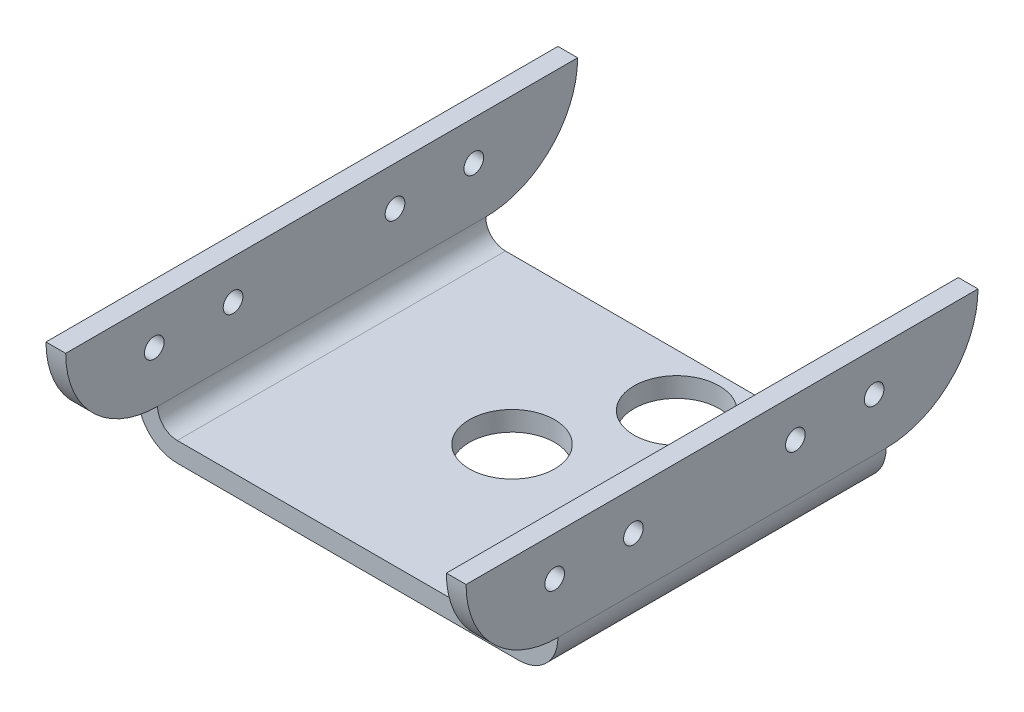
ISO-10303-21;
HEADER;
FILE_DESCRIPTION(('STEP AP214'),'2;1');
FILE_NAME('part.step','',(''),(''),'','','');
FILE_SCHEMA(('AUTOMOTIVE_DESIGN { 1 0 10303 214 1 1 1 1 }'));
ENDSEC;
DATA;
#1=APPLICATION_CONTEXT('core data for automotive mechanical design processes');
#2=APPLICATION_PROTOCOL_DEFINITION('international standard','automotive_design',2000,#1);
#3=PRODUCT_CONTEXT('',#1,'mechanical');
#4=PRODUCT('Part','Part','',(#3));
#5=PRODUCT_RELATED_PRODUCT_CATEGORY('part','',(#4));
#6=PRODUCT_DEFINITION_FORMATION('','',#4);
#7=PRODUCT_DEFINITION_CONTEXT('part definition',#1,'design');
#8=PRODUCT_DEFINITION('design','',#6,#7);
#9=PRODUCT_DEFINITION_SHAPE('','',#8);
#10=(LENGTH_UNIT() NAMED_UNIT(*) SI_UNIT(.MILLI.,.METRE.));
#11=(NAMED_UNIT(*) PLANE_ANGLE_UNIT() SI_UNIT($,.RADIAN.));
#12=(NAMED_UNIT(*) SI_UNIT($,.STERADIAN.) SOLID_ANGLE_UNIT());
#13=UNCERTAINTY_MEASURE_WITH_UNIT(LENGTH_MEASURE(1.E-05),#10,'distance_accuracy_value','');
#14=(GEOMETRIC_REPRESENTATION_CONTEXT(3) GLOBAL_UNCERTAINTY_ASSIGNED_CONTEXT((#13)) GLOBAL_UNIT_ASSIGNED_CONTEXT((#10,
#11,#12)) REPRESENTATION_CONTEXT('',''));
#15=CARTESIAN_POINT('',(0.,0.,0.));
#16=DIRECTION('',(0.,0.,1.));
#17=DIRECTION('',(1.,0.,0.));
#18=AXIS2_PLACEMENT_3D('',#15,#16,#17);
#19=CARTESIAN_POINT('',(98.0428571428571,0.,156.));
#20=DIRECTION('',(-1.,0.,0.));
#21=DIRECTION('',(0.,0.,1.));
#22=AXIS2_PLACEMENT_3D('',#19,#20,#21);
#23=PLANE('',#22);
#24=CARTESIAN_POINT('',(98.0428571428571,28.0000000000001,31.6473535322335));
#25=DIRECTION('',(-1.,0.,0.));
#26=DIRECTION('',(0.,0.,1.));
#27=AXIS2_PLACEMENT_3D('',#24,#25,#26);
#28=CIRCLE('',#27,2.99999999999999);
#29=CARTESIAN_POINT('',(98.0428571428571,28.0000000000001,34.6473535322335));
#30=VERTEX_POINT('',#29);
#31=EDGE_CURVE('E293',#30,#30,#28,.T.);
#32=ORIENTED_EDGE('',*,*,#31,.T.);
#33=EDGE_LOOP('',(#32));
#34=FACE_BOUND('',#33,.T.);
#35=CARTESIAN_POINT('',(98.0428571428571,28.0000000000001,55.6473535322335));
#36=DIRECTION('',(-1.,0.,0.));
#37=DIRECTION('',(0.,0.,1.));
#38=AXIS2_PLACEMENT_3D('',#35,#36,#37);
#39=CIRCLE('',#38,3.);
#40=CARTESIAN_POINT('',(98.0428571428571,28.0000000000001,58.6473535322335));
#41=VERTEX_POINT('',#40);
#42=EDGE_CURVE('E304',#41,#41,#39,.T.);
#43=ORIENTED_EDGE('',*,*,#42,.T.);
#44=EDGE_LOOP('',(#43));
#45=FACE_BOUND('',#44,.T.);
#46=CARTESIAN_POINT('',(98.0428571428571,28.,105.));
#47=DIRECTION('',(-1.,0.,0.));
#48=DIRECTION('',(0.,0.,1.));
#49=AXIS2_PLACEMENT_3D('',#46,#47,#48);
#50=CIRCLE('',#49,2.99999999999999);
#51=CARTESIAN_POINT('',(98.0428571428571,28.,108.));
#52=VERTEX_POINT('',#51);
#53=EDGE_CURVE('E297',#52,#52,#50,.T.);
#54=ORIENTED_EDGE('',*,*,#53,.T.);
#55=EDGE_LOOP('',(#54));
#56=FACE_BOUND('',#55,.T.);
#57=CARTESIAN_POINT('',(98.0428571428571,28.,129.));
#58=DIRECTION('',(-1.,0.,0.));
#59=DIRECTION('',(0.,0.,1.));
#60=AXIS2_PLACEMENT_3D('',#57,#58,#59);
#61=CIRCLE('',#60,2.99999999999999);
#62=CARTESIAN_POINT('',(98.0428571428571,28.,132.));
#63=VERTEX_POINT('',#62);
#64=EDGE_CURVE('E298',#63,#63,#61,.T.);
#65=ORIENTED_EDGE('',*,*,#64,.T.);
#66=EDGE_LOOP('',(#65));
#67=FACE_BOUND('',#66,.T.);
#68=DIRECTION('',(0.,0.,-1.));
#69=VECTOR('',#68,1.);
#70=CARTESIAN_POINT('',(98.0428571428571,40.,156.));
#71=LINE('',#70,#69);
#72=CARTESIAN_POINT('',(98.0428571428571,40.,156.));
#73=VERTEX_POINT('',#72);
#74=CARTESIAN_POINT('',(98.0428571428571,40.,0.));
#75=VERTEX_POINT('',#74);
#76=EDGE_CURVE('E179',#73,#75,#71,.T.);
#77=ORIENTED_EDGE('',*,*,#76,.F.);
#78=CARTESIAN_POINT('',(98.0428571428571,40.,128.));
#79=DIRECTION('',(-1.,0.,0.));
#80=DIRECTION('',(0.,0.,-1.));
#81=AXIS2_PLACEMENT_3D('',#78,#79,#80);
#82=CIRCLE('',#81,28.);
#83=CARTESIAN_POINT('',(98.0428571428571,12.,128.));
#84=VERTEX_POINT('',#83);
#85=EDGE_CURVE('E58',#84,#73,#82,.T.);
#86=ORIENTED_EDGE('',*,*,#85,.F.);
#87=DIRECTION('',(0.,0.,-1.));
#88=VECTOR('',#87,1.);
#89=CARTESIAN_POINT('',(98.0428571428571,12.,156.));
#90=LINE('',#89,#88);
#91=CARTESIAN_POINT('',(98.0428571428571,12.,28.));
#92=VERTEX_POINT('',#91);
#93=EDGE_CURVE('E141',#84,#92,#90,.T.);
#94=ORIENTED_EDGE('',*,*,#93,.T.);
#95=CARTESIAN_POINT('',(98.0428571428571,40.,28.));
#96=DIRECTION('',(-1.,0.,0.));
#97=DIRECTION('',(0.,0.,1.));
#98=AXIS2_PLACEMENT_3D('',#95,#96,#97);
#99=CIRCLE('',#98,28.);
#100=EDGE_CURVE('E194',#75,#92,#99,.T.);
#101=ORIENTED_EDGE('',*,*,#100,.F.);
#102=EDGE_LOOP('',(#77,#86,#94,#101));
#103=FACE_BOUND('',#102,.T.);
#104=ADVANCED_FACE('F44',(#34,#45,#56,#67,#103),#23,.F.);
#105=CARTESIAN_POINT('',(92.0428571428571,40.,156.));
#106=DIRECTION('',(0.,1.,0.));
#107=DIRECTION('',(0.,0.,1.));
#108=AXIS2_PLACEMENT_3D('',#105,#106,#107);
#109=PLANE('',#108);
#110=DIRECTION('',(1.,0.,0.));
#111=VECTOR('',#110,1.);
#112=CARTESIAN_POINT('',(92.0428571428571,40.,0.));
#113=LINE('',#112,#111);
#114=CARTESIAN_POINT('',(92.0428571428571,40.,0.));
#115=VERTEX_POINT('',#114);
#116=EDGE_CURVE('E230',#115,#75,#113,.T.);
#117=ORIENTED_EDGE('',*,*,#116,.F.);
#118=DIRECTION('',(0.,0.,-1.));
#119=VECTOR('',#118,1.);
#120=CARTESIAN_POINT('',(92.0428571428571,40.,156.));
#121=LINE('',#120,#119);
#122=CARTESIAN_POINT('',(92.0428571428571,40.,156.));
#123=VERTEX_POINT('',#122);
#124=EDGE_CURVE('E176',#123,#115,#121,.T.);
#125=ORIENTED_EDGE('',*,*,#124,.F.);
#126=DIRECTION('',(1.,0.,0.));
#127=VECTOR('',#126,1.);
#128=CARTESIAN_POINT('',(92.0428571428571,40.,156.));
#129=LINE('',#128,#127);
#130=EDGE_CURVE('E142',#123,#73,#129,.T.);
#131=ORIENTED_EDGE('',*,*,#130,.T.);
#132=ORIENTED_EDGE('',*,*,#76,.T.);
#133=EDGE_LOOP('',(#117,#125,#131,#132));
#134=FACE_BOUND('',#133,.T.);
#135=ADVANCED_FACE('F350',(#134),#109,.T.);
#136=CARTESIAN_POINT('',(92.0428571428571,0.,156.));
#137=DIRECTION('',(-1.,0.,0.));
#138=DIRECTION('',(0.,0.,1.));
#139=AXIS2_PLACEMENT_3D('',#136,#137,#138);
#140=PLANE('',#139);
#141=CARTESIAN_POINT('',(92.0428571428571,28.0000000000001,31.6473535322335));
#142=DIRECTION('',(-1.,0.,0.));
#143=DIRECTION('',(0.,0.,1.));
#144=AXIS2_PLACEMENT_3D('',#141,#142,#143);
#145=CIRCLE('',#144,2.99999999999999);
#146=CARTESIAN_POINT('',(92.0428571428571,28.0000000000001,34.6473535322335));
#147=VERTEX_POINT('',#146);
#148=EDGE_CURVE('E267',#147,#147,#145,.T.);
#149=ORIENTED_EDGE('',*,*,#148,.F.);
#150=EDGE_LOOP('',(#149));
#151=FACE_BOUND('',#150,.T.);
#152=CARTESIAN_POINT('',(92.0428571428571,28.0000000000001,55.6473535322335));
#153=DIRECTION('',(-1.,0.,0.));
#154=DIRECTION('',(0.,0.,1.));
#155=AXIS2_PLACEMENT_3D('',#152,#153,#154);
#156=CIRCLE('',#155,3.);
#157=CARTESIAN_POINT('',(92.0428571428571,28.0000000000001,58.6473535322335));
#158=VERTEX_POINT('',#157);
#159=EDGE_CURVE('E275',#158,#158,#156,.T.);
#160=ORIENTED_EDGE('',*,*,#159,.F.);
#161=EDGE_LOOP('',(#160));
#162=FACE_BOUND('',#161,.T.);
#163=CARTESIAN_POINT('',(92.0428571428571,28.,105.));
#164=DIRECTION('',(-1.,0.,0.));
#165=DIRECTION('',(0.,0.,1.));
#166=AXIS2_PLACEMENT_3D('',#163,#164,#165);
#167=CIRCLE('',#166,2.99999999999999);
#168=CARTESIAN_POINT('',(92.0428571428571,28.,108.));
#169=VERTEX_POINT('',#168);
#170=EDGE_CURVE('E281',#169,#169,#167,.T.);
#171=ORIENTED_EDGE('',*,*,#170,.F.);
#172=EDGE_LOOP('',(#171));
#173=FACE_BOUND('',#172,.T.);
#174=CARTESIAN_POINT('',(92.0428571428571,28.,129.));
#175=DIRECTION('',(-1.,0.,0.));
#176=DIRECTION('',(0.,0.,1.));
#177=AXIS2_PLACEMENT_3D('',#174,#175,#176);
#178=CIRCLE('',#177,2.99999999999999);
#179=CARTESIAN_POINT('',(92.0428571428571,28.,132.));
#180=VERTEX_POINT('',#179);
#181=EDGE_CURVE('E287',#180,#180,#178,.T.);
#182=ORIENTED_EDGE('',*,*,#181,.F.);
#183=EDGE_LOOP('',(#182));
#184=FACE_BOUND('',#183,.T.);
#185=CARTESIAN_POINT('',(92.0428571428571,40.,128.));
#186=DIRECTION('',(-1.,0.,0.));
#187=DIRECTION('',(0.,0.,1.));
#188=AXIS2_PLACEMENT_3D('',#185,#186,#187);
#189=CIRCLE('',#188,28.);
#190=CARTESIAN_POINT('',(92.0428571428571,12.,128.));
#191=VERTEX_POINT('',#190);
#192=EDGE_CURVE('E213',#123,#191,#189,.F.);
#193=ORIENTED_EDGE('',*,*,#192,.F.);
#194=ORIENTED_EDGE('',*,*,#124,.T.);
#195=CARTESIAN_POINT('',(92.0428571428571,40.,28.));
#196=DIRECTION('',(-1.,0.,0.));
#197=DIRECTION('',(0.,0.,1.));
#198=AXIS2_PLACEMENT_3D('',#195,#196,#197);
#199=CIRCLE('',#198,28.);
#200=CARTESIAN_POINT('',(92.0428571428571,12.,28.));
#201=VERTEX_POINT('',#200);
#202=EDGE_CURVE('E242',#201,#115,#199,.F.);
#203=ORIENTED_EDGE('',*,*,#202,.F.);
#204=DIRECTION('',(0.,0.,-1.));
#205=VECTOR('',#204,1.);
#206=CARTESIAN_POINT('',(92.0428571428571,12.,156.));
#207=LINE('',#206,#205);
#208=EDGE_CURVE('E173',#191,#201,#207,.T.);
#209=ORIENTED_EDGE('',*,*,#208,.F.);
#210=EDGE_LOOP('',(#193,#194,#203,#209));
#211=FACE_BOUND('',#210,.T.);
#212=ADVANCED_FACE('F357',(#151,#162,#173,#184,#211),#140,.T.);
#213=CARTESIAN_POINT('',(86.0428571428571,12.,156.));
#214=DIRECTION('',(0.,0.,-1.));
#215=DIRECTION('',(-1.,0.,0.));
#216=AXIS2_PLACEMENT_3D('',#213,#214,#215);
#217=CYLINDRICAL_SURFACE('',#216,6.);
#218=CARTESIAN_POINT('',(86.0428571428571,12.,128.));
#219=DIRECTION('',(0.,0.,-1.));
#220=DIRECTION('',(-1.,0.,0.));
#221=AXIS2_PLACEMENT_3D('',#218,#219,#220);
#222=CIRCLE('',#221,6.);
#223=CARTESIAN_POINT('',(86.0428571428571,6.,128.));
#224=VERTEX_POINT('',#223);
#225=EDGE_CURVE('E228',#191,#224,#222,.T.);
#226=ORIENTED_EDGE('',*,*,#225,.F.);
#227=ORIENTED_EDGE('',*,*,#208,.T.);
#228=CARTESIAN_POINT('',(86.0428571428571,12.,28.));
#229=DIRECTION('',(0.,0.,1.));
#230=DIRECTION('',(1.,0.,0.));
#231=AXIS2_PLACEMENT_3D('',#228,#229,#230);
#232=CIRCLE('',#231,6.);
#233=CARTESIAN_POINT('',(86.0428571428571,6.,28.));
#234=VERTEX_POINT('',#233);
#235=EDGE_CURVE('E221',#234,#201,#232,.T.);
#236=ORIENTED_EDGE('',*,*,#235,.F.);
#237=DIRECTION('',(0.,0.,-1.));
#238=VECTOR('',#237,1.);
#239=CARTESIAN_POINT('',(86.0428571428571,6.,156.));
#240=LINE('',#239,#238);
#241=EDGE_CURVE('E170',#224,#234,#240,.T.);
#242=ORIENTED_EDGE('',*,*,#241,.F.);
#243=EDGE_LOOP('',(#226,#227,#236,#242));
#244=FACE_BOUND('',#243,.T.);
#245=ADVANCED_FACE('F392',(#244),#217,.F.);
#246=CARTESIAN_POINT('',(-29.9571428571429,6.,156.));
#247=DIRECTION('',(0.,1.,0.));
#248=DIRECTION('',(0.,0.,1.));
#249=AXIS2_PLACEMENT_3D('',#246,#247,#248);
#250=PLANE('',#249);
#251=CARTESIAN_POINT('',(34.0428571428571,6.,78.));
#252=DIRECTION('',(0.,1.,0.));
#253=DIRECTION('',(0.,0.,1.));
#254=AXIS2_PLACEMENT_3D('',#251,#252,#253);
#255=CIRCLE('',#254,13.);
#256=CARTESIAN_POINT('',(34.0428571428571,6.,91.));
#257=VERTEX_POINT('',#256);
#258=EDGE_CURVE('E254',#257,#257,#255,.T.);
#259=ORIENTED_EDGE('',*,*,#258,.F.);
#260=EDGE_LOOP('',(#259));
#261=FACE_BOUND('',#260,.T.);
#262=CARTESIAN_POINT('',(50.2126085257987,6.,44.));
#263=DIRECTION('',(0.,1.,0.));
#264=DIRECTION('',(0.,0.,1.));
#265=AXIS2_PLACEMENT_3D('',#262,#263,#264);
#266=CIRCLE('',#265,13.);
#267=CARTESIAN_POINT('',(50.2126085257987,6.,57.));
#268=VERTEX_POINT('',#267);
#269=EDGE_CURVE('E260',#268,#268,#266,.T.);
#270=ORIENTED_EDGE('',*,*,#269,.F.);
#271=EDGE_LOOP('',(#270));
#272=FACE_BOUND('',#271,.T.);
#273=DIRECTION('',(-1.,0.,0.));
#274=VECTOR('',#273,1.);
#275=CARTESIAN_POINT('',(-29.9571428571429,6.,128.));
#276=LINE('',#275,#274);
#277=CARTESIAN_POINT('',(-17.9571428571429,6.,128.));
#278=VERTEX_POINT('',#277);
#279=EDGE_CURVE('E226',#224,#278,#276,.T.);
#280=ORIENTED_EDGE('',*,*,#279,.F.);
#281=ORIENTED_EDGE('',*,*,#241,.T.);
#282=DIRECTION('',(1.,0.,0.));
#283=VECTOR('',#282,1.);
#284=CARTESIAN_POINT('',(-29.9571428571429,6.,28.));
#285=LINE('',#284,#283);
#286=CARTESIAN_POINT('',(-17.9571428571429,6.,28.));
#287=VERTEX_POINT('',#286);
#288=EDGE_CURVE('E215',#287,#234,#285,.T.);
#289=ORIENTED_EDGE('',*,*,#288,.F.);
#290=DIRECTION('',(0.,0.,-1.));
#291=VECTOR('',#290,1.);
#292=CARTESIAN_POINT('',(-17.9571428571429,6.,156.));
#293=LINE('',#292,#291);
#294=EDGE_CURVE('E167',#278,#287,#293,.T.);
#295=ORIENTED_EDGE('',*,*,#294,.F.);
#296=EDGE_LOOP('',(#280,#281,#289,#295));
#297=FACE_BOUND('',#296,.T.);
#298=ADVANCED_FACE('F438',(#261,#272,#297),#250,.T.);
#299=CARTESIAN_POINT('',(-17.9571428571429,12.,156.));
#300=DIRECTION('',(0.,0.,-1.));
#301=DIRECTION('',(-1.,0.,0.));
#302=AXIS2_PLACEMENT_3D('',#299,#300,#301);
#303=CYLINDRICAL_SURFACE('',#302,6.);
#304=CARTESIAN_POINT('',(-17.9571428571429,12.,128.));
#305=DIRECTION('',(0.,0.,-1.));
#306=DIRECTION('',(-1.,0.,0.));
#307=AXIS2_PLACEMENT_3D('',#304,#305,#306);
#308=CIRCLE('',#307,6.);
#309=CARTESIAN_POINT('',(-23.9571428571429,12.,128.));
#310=VERTEX_POINT('',#309);
#311=EDGE_CURVE('E224',#278,#310,#308,.T.);
#312=ORIENTED_EDGE('',*,*,#311,.F.);
#313=ORIENTED_EDGE('',*,*,#294,.T.);
#314=CARTESIAN_POINT('',(-17.9571428571429,12.,28.));
#315=DIRECTION('',(0.,0.,1.));
#316=DIRECTION('',(1.,0.,0.));
#317=AXIS2_PLACEMENT_3D('',#314,#315,#316);
#318=CIRCLE('',#317,6.);
#319=CARTESIAN_POINT('',(-23.9571428571429,12.,28.));
#320=VERTEX_POINT('',#319);
#321=EDGE_CURVE('E212',#320,#287,#318,.T.);
#322=ORIENTED_EDGE('',*,*,#321,.F.);
#323=DIRECTION('',(0.,0.,-1.));
#324=VECTOR('',#323,1.);
#325=CARTESIAN_POINT('',(-23.9571428571429,12.,156.));
#326=LINE('',#325,#324);
#327=EDGE_CURVE('E159',#310,#320,#326,.T.);
#328=ORIENTED_EDGE('',*,*,#327,.F.);
#329=EDGE_LOOP('',(#312,#313,#322,#328));
#330=FACE_BOUND('',#329,.T.);
#331=ADVANCED_FACE('F434',(#330),#303,.F.);
#332=CARTESIAN_POINT('',(-23.9571428571429,40.,156.));
#333=DIRECTION('',(1.,0.,0.));
#334=DIRECTION('',(0.,1.,0.));
#335=AXIS2_PLACEMENT_3D('',#332,#333,#334);
#336=PLANE('',#335);
#337=CARTESIAN_POINT('',(-23.9571428571429,28.0000000000001,31.6473535322335));
#338=DIRECTION('',(1.,0.,0.));
#339=DIRECTION('',(0.,1.,0.));
#340=AXIS2_PLACEMENT_3D('',#337,#338,#339);
#341=CIRCLE('',#340,2.99999999999999);
#342=CARTESIAN_POINT('',(-23.9571428571429,31.0000000000001,31.6473535322335));
#343=VERTEX_POINT('',#342);
#344=EDGE_CURVE('E272',#343,#343,#341,.T.);
#345=ORIENTED_EDGE('',*,*,#344,.F.);
#346=EDGE_LOOP('',(#345));
#347=FACE_BOUND('',#346,.T.);
#348=CARTESIAN_POINT('',(-23.9571428571429,28.0000000000001,55.6473535322335));
#349=DIRECTION('',(1.,0.,0.));
#350=DIRECTION('',(0.,1.,0.));
#351=AXIS2_PLACEMENT_3D('',#348,#349,#350);
#352=CIRCLE('',#351,3.);
#353=CARTESIAN_POINT('',(-23.9571428571429,31.0000000000001,55.6473535322335));
#354=VERTEX_POINT('',#353);
#355=EDGE_CURVE('E278',#354,#354,#352,.T.);
#356=ORIENTED_EDGE('',*,*,#355,.F.);
#357=EDGE_LOOP('',(#356));
#358=FACE_BOUND('',#357,.T.);
#359=CARTESIAN_POINT('',(-23.9571428571429,28.,105.));
#360=DIRECTION('',(1.,0.,0.));
#361=DIRECTION('',(0.,1.,0.));
#362=AXIS2_PLACEMENT_3D('',#359,#360,#361);
#363=CIRCLE('',#362,2.99999999999999);
#364=CARTESIAN_POINT('',(-23.9571428571429,31.,105.));
#365=VERTEX_POINT('',#364);
#366=EDGE_CURVE('E284',#365,#365,#363,.T.);
#367=ORIENTED_EDGE('',*,*,#366,.F.);
#368=EDGE_LOOP('',(#367));
#369=FACE_BOUND('',#368,.T.);
#370=CARTESIAN_POINT('',(-23.9571428571429,28.,129.));
#371=DIRECTION('',(1.,0.,0.));
#372=DIRECTION('',(0.,1.,0.));
#373=AXIS2_PLACEMENT_3D('',#370,#371,#372);
#374=CIRCLE('',#373,2.99999999999999);
#375=CARTESIAN_POINT('',(-23.9571428571429,31.,129.));
#376=VERTEX_POINT('',#375);
#377=EDGE_CURVE('E290',#376,#376,#374,.T.);
#378=ORIENTED_EDGE('',*,*,#377,.F.);
#379=EDGE_LOOP('',(#378));
#380=FACE_BOUND('',#379,.T.);
#381=CARTESIAN_POINT('',(-23.9571428571429,40.,128.));
#382=DIRECTION('',(1.,0.,0.));
#383=DIRECTION('',(0.,1.,0.));
#384=AXIS2_PLACEMENT_3D('',#381,#382,#383);
#385=CIRCLE('',#384,28.);
#386=CARTESIAN_POINT('',(-23.9571428571429,40.,156.));
#387=VERTEX_POINT('',#386);
#388=EDGE_CURVE('E136',#310,#387,#385,.F.);
#389=ORIENTED_EDGE('',*,*,#388,.F.);
#390=ORIENTED_EDGE('',*,*,#327,.T.);
#391=CARTESIAN_POINT('',(-23.9571428571429,40.,28.));
#392=DIRECTION('',(1.,0.,0.));
#393=DIRECTION('',(0.,1.,0.));
#394=AXIS2_PLACEMENT_3D('',#391,#392,#393);
#395=CIRCLE('',#394,28.);
#396=CARTESIAN_POINT('',(-23.9571428571429,40.,0.));
#397=VERTEX_POINT('',#396);
#398=EDGE_CURVE('E237',#397,#320,#395,.F.);
#399=ORIENTED_EDGE('',*,*,#398,.F.);
#400=DIRECTION('',(0.,0.,-1.));
#401=VECTOR('',#400,1.);
#402=CARTESIAN_POINT('',(-23.9571428571429,40.,156.));
#403=LINE('',#402,#401);
#404=EDGE_CURVE('E157',#387,#397,#403,.T.);
#405=ORIENTED_EDGE('',*,*,#404,.F.);
#406=EDGE_LOOP('',(#389,#390,#399,#405));
#407=FACE_BOUND('',#406,.T.);
#408=ADVANCED_FACE('F240',(#347,#358,#369,#380,#407),#336,.T.);
#409=CARTESIAN_POINT('',(-29.9571428571429,40.,156.));
#410=DIRECTION('',(0.,1.,0.));
#411=DIRECTION('',(0.,0.,1.));
#412=AXIS2_PLACEMENT_3D('',#409,#410,#411);
#413=PLANE('',#412);
#414=DIRECTION('',(1.,0.,0.));
#415=VECTOR('',#414,1.);
#416=CARTESIAN_POINT('',(-29.9571428571429,40.,0.));
#417=LINE('',#416,#415);
#418=CARTESIAN_POINT('',(-29.9571428571429,40.,0.));
#419=VERTEX_POINT('',#418);
#420=EDGE_CURVE('E156',#419,#397,#417,.T.);
#421=ORIENTED_EDGE('',*,*,#420,.F.);
#422=DIRECTION('',(0.,0.,-1.));
#423=VECTOR('',#422,1.);
#424=CARTESIAN_POINT('',(-29.9571428571429,40.,156.));
#425=LINE('',#424,#423);
#426=CARTESIAN_POINT('',(-29.9571428571429,40.,156.));
#427=VERTEX_POINT('',#426);
#428=EDGE_CURVE('E149',#427,#419,#425,.T.);
#429=ORIENTED_EDGE('',*,*,#428,.F.);
#430=DIRECTION('',(1.,0.,0.));
#431=VECTOR('',#430,1.);
#432=CARTESIAN_POINT('',(-29.9571428571429,40.,156.));
#433=LINE('',#432,#431);
#434=EDGE_CURVE('E129',#427,#387,#433,.T.);
#435=ORIENTED_EDGE('',*,*,#434,.T.);
#436=ORIENTED_EDGE('',*,*,#404,.T.);
#437=EDGE_LOOP('',(#421,#429,#435,#436));
#438=FACE_BOUND('',#437,.T.);
#439=ADVANCED_FACE('F155',(#438),#413,.T.);
#440=CARTESIAN_POINT('',(-29.9571428571429,40.,156.));
#441=DIRECTION('',(1.,0.,0.));
#442=DIRECTION('',(0.,1.,0.));
#443=AXIS2_PLACEMENT_3D('',#440,#441,#442);
#444=PLANE('',#443);
#445=CARTESIAN_POINT('',(-29.9571428571429,28.0000000000001,31.6473535322335));
#446=DIRECTION('',(-1.,0.,0.));
#447=DIRECTION('',(0.,0.,1.));
#448=AXIS2_PLACEMENT_3D('',#445,#446,#447);
#449=CIRCLE('',#448,2.99999999999999);
#450=CARTESIAN_POINT('',(-29.9571428571429,28.0000000000001,34.6473535322335));
#451=VERTEX_POINT('',#450);
#452=EDGE_CURVE('E310',#451,#451,#449,.T.);
#453=ORIENTED_EDGE('',*,*,#452,.F.);
#454=EDGE_LOOP('',(#453));
#455=FACE_BOUND('',#454,.T.);
#456=CARTESIAN_POINT('',(-29.9571428571429,28.0000000000001,55.6473535322335));
#457=DIRECTION('',(-1.,0.,0.));
#458=DIRECTION('',(0.,0.,1.));
#459=AXIS2_PLACEMENT_3D('',#456,#457,#458);
#460=CIRCLE('',#459,3.);
#461=CARTESIAN_POINT('',(-29.9571428571429,28.0000000000001,58.6473535322335));
#462=VERTEX_POINT('',#461);
#463=EDGE_CURVE('E307',#462,#462,#460,.T.);
#464=ORIENTED_EDGE('',*,*,#463,.F.);
#465=EDGE_LOOP('',(#464));
#466=FACE_BOUND('',#465,.T.);
#467=CARTESIAN_POINT('',(-29.9571428571429,28.,105.));
#468=DIRECTION('',(-1.,0.,0.));
#469=DIRECTION('',(0.,0.,1.));
#470=AXIS2_PLACEMENT_3D('',#467,#468,#469);
#471=CIRCLE('',#470,2.99999999999999);
#472=CARTESIAN_POINT('',(-29.9571428571429,28.,108.));
#473=VERTEX_POINT('',#472);
#474=EDGE_CURVE('E301',#473,#473,#471,.T.);
#475=ORIENTED_EDGE('',*,*,#474,.F.);
#476=EDGE_LOOP('',(#475));
#477=FACE_BOUND('',#476,.T.);
#478=CARTESIAN_POINT('',(-29.9571428571429,28.,129.));
#479=DIRECTION('',(-1.,0.,0.));
#480=DIRECTION('',(0.,0.,1.));
#481=AXIS2_PLACEMENT_3D('',#478,#479,#480);
#482=CIRCLE('',#481,2.99999999999999);
#483=CARTESIAN_POINT('',(-29.9571428571429,28.,132.));
#484=VERTEX_POINT('',#483);
#485=EDGE_CURVE('E294',#484,#484,#482,.T.);
#486=ORIENTED_EDGE('',*,*,#485,.F.);
#487=EDGE_LOOP('',(#486));
#488=FACE_BOUND('',#487,.T.);
#489=DIRECTION('',(0.,0.,-1.));
#490=VECTOR('',#489,1.);
#491=CARTESIAN_POINT('',(-29.9571428571429,12.,156.));
#492=LINE('',#491,#490);
#493=CARTESIAN_POINT('',(-29.9571428571429,12.,128.));
#494=VERTEX_POINT('',#493);
#495=CARTESIAN_POINT('',(-29.9571428571429,12.,28.));
#496=VERTEX_POINT('',#495);
#497=EDGE_CURVE('E152',#494,#496,#492,.T.);
#498=ORIENTED_EDGE('',*,*,#497,.F.);
#499=CARTESIAN_POINT('',(-29.9571428571429,40.,128.));
#500=DIRECTION('',(-1.,0.,0.));
#501=DIRECTION('',(0.,0.,-1.));
#502=AXIS2_PLACEMENT_3D('',#499,#500,#501);
#503=CIRCLE('',#502,28.);
#504=EDGE_CURVE('E133',#494,#427,#503,.T.);
#505=ORIENTED_EDGE('',*,*,#504,.T.);
#506=ORIENTED_EDGE('',*,*,#428,.T.);
#507=CARTESIAN_POINT('',(-29.9571428571429,40.,28.));
#508=DIRECTION('',(-1.,0.,0.));
#509=DIRECTION('',(0.,0.,1.));
#510=AXIS2_PLACEMENT_3D('',#507,#508,#509);
#511=CIRCLE('',#510,28.);
#512=EDGE_CURVE('E238',#419,#496,#511,.T.);
#513=ORIENTED_EDGE('',*,*,#512,.T.);
#514=EDGE_LOOP('',(#498,#505,#506,#513));
#515=FACE_BOUND('',#514,.T.);
#516=ADVANCED_FACE('F147',(#455,#466,#477,#488,#515),#444,.F.);
#517=CARTESIAN_POINT('',(-17.9571428571429,12.,156.));
#518=DIRECTION('',(0.,0.,-1.));
#519=DIRECTION('',(-1.,0.,0.));
#520=AXIS2_PLACEMENT_3D('',#517,#518,#519);
#521=CYLINDRICAL_SURFACE('',#520,12.);
#522=DIRECTION('',(0.,0.,-1.));
#523=VECTOR('',#522,1.);
#524=CARTESIAN_POINT('',(-17.9571428571429,0.,156.));
#525=LINE('',#524,#523);
#526=CARTESIAN_POINT('',(-17.9571428571429,0.,128.));
#527=VERTEX_POINT('',#526);
#528=CARTESIAN_POINT('',(-17.9571428571429,0.,28.));
#529=VERTEX_POINT('',#528);
#530=EDGE_CURVE('E161',#527,#529,#525,.T.);
#531=ORIENTED_EDGE('',*,*,#530,.F.);
#532=CARTESIAN_POINT('',(-17.9571428571429,12.,128.));
#533=DIRECTION('',(0.,0.,-1.));
#534=DIRECTION('',(-1.,0.,0.));
#535=AXIS2_PLACEMENT_3D('',#532,#533,#534);
#536=CIRCLE('',#535,12.);
#537=EDGE_CURVE('E208',#527,#494,#536,.T.);
#538=ORIENTED_EDGE('',*,*,#537,.T.);
#539=ORIENTED_EDGE('',*,*,#497,.T.);
#540=CARTESIAN_POINT('',(-17.9571428571429,12.,28.));
#541=DIRECTION('',(0.,0.,1.));
#542=DIRECTION('',(1.,0.,0.));
#543=AXIS2_PLACEMENT_3D('',#540,#541,#542);
#544=CIRCLE('',#543,12.);
#545=EDGE_CURVE('E209',#496,#529,#544,.T.);
#546=ORIENTED_EDGE('',*,*,#545,.T.);
#547=EDGE_LOOP('',(#531,#538,#539,#546));
#548=FACE_BOUND('',#547,.T.);
#549=ADVANCED_FACE('F207',(#548),#521,.T.);
#550=CARTESIAN_POINT('',(-29.9571428571429,0.,156.));
#551=DIRECTION('',(0.,1.,0.));
#552=DIRECTION('',(0.,0.,1.));
#553=AXIS2_PLACEMENT_3D('',#550,#551,#552);
#554=PLANE('',#553);
#555=CARTESIAN_POINT('',(34.0428571428571,0.,78.));
#556=DIRECTION('',(0.,-1.,0.));
#557=DIRECTION('',(0.,0.,-1.));
#558=AXIS2_PLACEMENT_3D('',#555,#556,#557);
#559=CIRCLE('',#558,13.);
#560=CARTESIAN_POINT('',(34.0428571428571,0.,65.));
#561=VERTEX_POINT('',#560);
#562=EDGE_CURVE('E263',#561,#561,#559,.T.);
#563=ORIENTED_EDGE('',*,*,#562,.F.);
#564=EDGE_LOOP('',(#563));
#565=FACE_BOUND('',#564,.T.);
#566=CARTESIAN_POINT('',(50.2126085257987,0.,44.));
#567=DIRECTION('',(0.,-1.,0.));
#568=DIRECTION('',(0.,0.,-1.));
#569=AXIS2_PLACEMENT_3D('',#566,#567,#568);
#570=CIRCLE('',#569,13.);
#571=CARTESIAN_POINT('',(50.2126085257987,0.,31.));
#572=VERTEX_POINT('',#571);
#573=EDGE_CURVE('E264',#572,#572,#570,.T.);
#574=ORIENTED_EDGE('',*,*,#573,.F.);
#575=EDGE_LOOP('',(#574));
#576=FACE_BOUND('',#575,.T.);
#577=DIRECTION('',(0.,0.,-1.));
#578=VECTOR('',#577,1.);
#579=CARTESIAN_POINT('',(86.0428571428571,0.,156.));
#580=LINE('',#579,#578);
#581=CARTESIAN_POINT('',(86.0428571428571,0.,128.));
#582=VERTEX_POINT('',#581);
#583=CARTESIAN_POINT('',(86.0428571428571,0.,28.));
#584=VERTEX_POINT('',#583);
#585=EDGE_CURVE('E188',#582,#584,#580,.T.);
#586=ORIENTED_EDGE('',*,*,#585,.F.);
#587=DIRECTION('',(1.,0.,0.));
#588=VECTOR('',#587,1.);
#589=CARTESIAN_POINT('',(-29.9571428571429,0.,128.));
#590=LINE('',#589,#588);
#591=EDGE_CURVE('E153',#527,#582,#590,.T.);
#592=ORIENTED_EDGE('',*,*,#591,.F.);
#593=ORIENTED_EDGE('',*,*,#530,.T.);
#594=DIRECTION('',(1.,0.,0.));
#595=VECTOR('',#594,1.);
#596=CARTESIAN_POINT('',(-29.9571428571429,0.,28.));
#597=LINE('',#596,#595);
#598=EDGE_CURVE('E204',#529,#584,#597,.T.);
#599=ORIENTED_EDGE('',*,*,#598,.T.);
#600=EDGE_LOOP('',(#586,#592,#593,#599));
#601=FACE_BOUND('',#600,.T.);
#602=ADVANCED_FACE('F203',(#565,#576,#601),#554,.F.);
#603=CARTESIAN_POINT('',(86.0428571428571,12.,156.));
#604=DIRECTION('',(0.,0.,-1.));
#605=DIRECTION('',(-1.,0.,0.));
#606=AXIS2_PLACEMENT_3D('',#603,#604,#605);
#607=CYLINDRICAL_SURFACE('',#606,12.);
#608=ORIENTED_EDGE('',*,*,#93,.F.);
#609=CARTESIAN_POINT('',(86.0428571428571,12.,128.));
#610=DIRECTION('',(0.,0.,-1.));
#611=DIRECTION('',(-1.,0.,0.));
#612=AXIS2_PLACEMENT_3D('',#609,#610,#611);
#613=CIRCLE('',#612,12.);
#614=EDGE_CURVE('E11',#84,#582,#613,.T.);
#615=ORIENTED_EDGE('',*,*,#614,.T.);
#616=ORIENTED_EDGE('',*,*,#585,.T.);
#617=CARTESIAN_POINT('',(86.0428571428571,12.,28.));
#618=DIRECTION('',(0.,0.,1.));
#619=DIRECTION('',(1.,0.,0.));
#620=AXIS2_PLACEMENT_3D('',#617,#618,#619);
#621=CIRCLE('',#620,12.);
#622=EDGE_CURVE('E52',#584,#92,#621,.T.);
#623=ORIENTED_EDGE('',*,*,#622,.T.);
#624=EDGE_LOOP('',(#608,#615,#616,#623));
#625=FACE_BOUND('',#624,.T.);
#626=ADVANCED_FACE('F186',(#625),#607,.T.);
#627=CARTESIAN_POINT('',(-29.9571428571429,12.,28.));
#628=DIRECTION('',(0.,0.,1.));
#629=DIRECTION('',(1.,0.,0.));
#630=AXIS2_PLACEMENT_3D('',#627,#628,#629);
#631=PLANE('',#630);
#632=ORIENTED_EDGE('',*,*,#235,.T.);
#633=DIRECTION('',(1.,0.,0.));
#634=VECTOR('',#633,1.);
#635=CARTESIAN_POINT('',(-29.9571428571429,12.,28.));
#636=LINE('',#635,#634);
#637=EDGE_CURVE('E253',#201,#92,#636,.T.);
#638=ORIENTED_EDGE('',*,*,#637,.T.);
#639=ORIENTED_EDGE('',*,*,#622,.F.);
#640=ORIENTED_EDGE('',*,*,#598,.F.);
#641=ORIENTED_EDGE('',*,*,#545,.F.);
#642=EDGE_CURVE('E250',#496,#320,#636,.T.);
#643=ORIENTED_EDGE('',*,*,#642,.T.);
#644=ORIENTED_EDGE('',*,*,#321,.T.);
#645=ORIENTED_EDGE('',*,*,#288,.T.);
#646=EDGE_LOOP('',(#632,#638,#639,#640,#641,#643,#644,#645));
#647=FACE_BOUND('',#646,.T.);
#648=ADVANCED_FACE('F420',(#647),#631,.F.);
#649=CARTESIAN_POINT('',(-29.9571428571429,40.,28.));
#650=DIRECTION('',(1.,0.,0.));
#651=DIRECTION('',(0.,0.,-1.));
#652=AXIS2_PLACEMENT_3D('',#649,#650,#651);
#653=CYLINDRICAL_SURFACE('',#652,28.);
#654=ORIENTED_EDGE('',*,*,#202,.T.);
#655=ORIENTED_EDGE('',*,*,#116,.T.);
#656=ORIENTED_EDGE('',*,*,#100,.T.);
#657=ORIENTED_EDGE('',*,*,#637,.F.);
#658=EDGE_LOOP('',(#654,#655,#656,#657));
#659=FACE_BOUND('',#658,.T.);
#660=ADVANCED_FACE('F419',(#659),#653,.T.);
#661=ORIENTED_EDGE('',*,*,#398,.T.);
#662=ORIENTED_EDGE('',*,*,#642,.F.);
#663=ORIENTED_EDGE('',*,*,#512,.F.);
#664=ORIENTED_EDGE('',*,*,#420,.T.);
#665=EDGE_LOOP('',(#661,#662,#663,#664));
#666=FACE_BOUND('',#665,.T.);
#667=ADVANCED_FACE('F236',(#666),#653,.T.);
#668=CARTESIAN_POINT('',(-29.9571428571429,12.,128.));
#669=DIRECTION('',(0.,0.,-1.));
#670=DIRECTION('',(-1.,0.,0.));
#671=AXIS2_PLACEMENT_3D('',#668,#669,#670);
#672=PLANE('',#671);
#673=ORIENTED_EDGE('',*,*,#225,.T.);
#674=ORIENTED_EDGE('',*,*,#279,.T.);
#675=ORIENTED_EDGE('',*,*,#311,.T.);
#676=DIRECTION('',(1.,0.,0.));
#677=VECTOR('',#676,1.);
#678=CARTESIAN_POINT('',(-29.9571428571429,12.,128.));
#679=LINE('',#678,#677);
#680=EDGE_CURVE('E243',#494,#310,#679,.T.);
#681=ORIENTED_EDGE('',*,*,#680,.F.);
#682=ORIENTED_EDGE('',*,*,#537,.F.);
#683=ORIENTED_EDGE('',*,*,#591,.T.);
#684=ORIENTED_EDGE('',*,*,#614,.F.);
#685=EDGE_CURVE('E246',#191,#84,#679,.T.);
#686=ORIENTED_EDGE('',*,*,#685,.F.);
#687=EDGE_LOOP('',(#673,#674,#675,#681,#682,#683,#684,#686));
#688=FACE_BOUND('',#687,.T.);
#689=ADVANCED_FACE('F407',(#688),#672,.F.);
#690=CARTESIAN_POINT('',(-29.9571428571429,40.,128.));
#691=DIRECTION('',(1.,0.,0.));
#692=DIRECTION('',(0.,0.,-1.));
#693=AXIS2_PLACEMENT_3D('',#690,#691,#692);
#694=CYLINDRICAL_SURFACE('',#693,28.);
#695=ORIENTED_EDGE('',*,*,#192,.T.);
#696=ORIENTED_EDGE('',*,*,#685,.T.);
#697=ORIENTED_EDGE('',*,*,#85,.T.);
#698=ORIENTED_EDGE('',*,*,#130,.F.);
#699=EDGE_LOOP('',(#695,#696,#697,#698));
#700=FACE_BOUND('',#699,.T.);
#701=ADVANCED_FACE('F405',(#700),#694,.T.);
#702=ORIENTED_EDGE('',*,*,#388,.T.);
#703=ORIENTED_EDGE('',*,*,#434,.F.);
#704=ORIENTED_EDGE('',*,*,#504,.F.);
#705=ORIENTED_EDGE('',*,*,#680,.T.);
#706=EDGE_LOOP('',(#702,#703,#704,#705));
#707=FACE_BOUND('',#706,.T.);
#708=ADVANCED_FACE('F131',(#707),#694,.T.);
#709=CARTESIAN_POINT('',(50.2126085257987,10.,44.));
#710=DIRECTION('',(0.,-1.,0.));
#711=DIRECTION('',(0.,0.,-1.));
#712=AXIS2_PLACEMENT_3D('',#709,#710,#711);
#713=CYLINDRICAL_SURFACE('',#712,13.);
#714=ORIENTED_EDGE('',*,*,#269,.T.);
#715=EDGE_LOOP('',(#714));
#716=FACE_BOUND('',#715,.T.);
#717=ORIENTED_EDGE('',*,*,#573,.T.);
#718=EDGE_LOOP('',(#717));
#719=FACE_BOUND('',#718,.T.);
#720=ADVANCED_FACE('F344',(#716,#719),#713,.F.);
#721=CARTESIAN_POINT('',(34.0428571428571,10.,78.));
#722=DIRECTION('',(0.,-1.,0.));
#723=DIRECTION('',(0.,0.,-1.));
#724=AXIS2_PLACEMENT_3D('',#721,#722,#723);
#725=CYLINDRICAL_SURFACE('',#724,13.);
#726=ORIENTED_EDGE('',*,*,#258,.T.);
#727=EDGE_LOOP('',(#726));
#728=FACE_BOUND('',#727,.T.);
#729=ORIENTED_EDGE('',*,*,#562,.T.);
#730=EDGE_LOOP('',(#729));
#731=FACE_BOUND('',#730,.T.);
#732=ADVANCED_FACE('F332',(#728,#731),#725,.F.);
#733=CARTESIAN_POINT('',(98.0428571428571,28.,129.));
#734=DIRECTION('',(-1.,0.,0.));
#735=DIRECTION('',(0.,0.,1.));
#736=AXIS2_PLACEMENT_3D('',#733,#734,#735);
#737=CYLINDRICAL_SURFACE('',#736,2.99999999999999);
#738=ORIENTED_EDGE('',*,*,#377,.T.);
#739=EDGE_LOOP('',(#738));
#740=FACE_BOUND('',#739,.T.);
#741=ORIENTED_EDGE('',*,*,#485,.T.);
#742=EDGE_LOOP('',(#741));
#743=FACE_BOUND('',#742,.T.);
#744=ADVANCED_FACE('F329',(#740,#743),#737,.F.);
#745=CARTESIAN_POINT('',(98.0428571428571,28.,105.));
#746=DIRECTION('',(-1.,0.,0.));
#747=DIRECTION('',(0.,0.,1.));
#748=AXIS2_PLACEMENT_3D('',#745,#746,#747);
#749=CYLINDRICAL_SURFACE('',#748,2.99999999999999);
#750=ORIENTED_EDGE('',*,*,#366,.T.);
#751=EDGE_LOOP('',(#750));
#752=FACE_BOUND('',#751,.T.);
#753=ORIENTED_EDGE('',*,*,#474,.T.);
#754=EDGE_LOOP('',(#753));
#755=FACE_BOUND('',#754,.T.);
#756=ADVANCED_FACE('F331',(#752,#755),#749,.F.);
#757=CARTESIAN_POINT('',(98.0428571428571,28.0000000000001,55.6473535322335));
#758=DIRECTION('',(-1.,0.,0.));
#759=DIRECTION('',(0.,0.,1.));
#760=AXIS2_PLACEMENT_3D('',#757,#758,#759);
#761=CYLINDRICAL_SURFACE('',#760,3.);
#762=ORIENTED_EDGE('',*,*,#355,.T.);
#763=EDGE_LOOP('',(#762));
#764=FACE_BOUND('',#763,.T.);
#765=ORIENTED_EDGE('',*,*,#463,.T.);
#766=EDGE_LOOP('',(#765));
#767=FACE_BOUND('',#766,.T.);
#768=ADVANCED_FACE('F340',(#764,#767),#761,.F.);
#769=CARTESIAN_POINT('',(98.0428571428571,28.0000000000001,31.6473535322335));
#770=DIRECTION('',(-1.,0.,0.));
#771=DIRECTION('',(0.,0.,1.));
#772=AXIS2_PLACEMENT_3D('',#769,#770,#771);
#773=CYLINDRICAL_SURFACE('',#772,2.99999999999999);
#774=ORIENTED_EDGE('',*,*,#344,.T.);
#775=EDGE_LOOP('',(#774));
#776=FACE_BOUND('',#775,.T.);
#777=ORIENTED_EDGE('',*,*,#452,.T.);
#778=EDGE_LOOP('',(#777));
#779=FACE_BOUND('',#778,.T.);
#780=ADVANCED_FACE('F318',(#776,#779),#773,.F.);
#781=ORIENTED_EDGE('',*,*,#181,.T.);
#782=EDGE_LOOP('',(#781));
#783=FACE_BOUND('',#782,.T.);
#784=ORIENTED_EDGE('',*,*,#64,.F.);
#785=EDGE_LOOP('',(#784));
#786=FACE_BOUND('',#785,.T.);
#787=ADVANCED_FACE('F335',(#783,#786),#737,.F.);
#788=ORIENTED_EDGE('',*,*,#170,.T.);
#789=EDGE_LOOP('',(#788));
#790=FACE_BOUND('',#789,.T.);
#791=ORIENTED_EDGE('',*,*,#53,.F.);
#792=EDGE_LOOP('',(#791));
#793=FACE_BOUND('',#792,.T.);
#794=ADVANCED_FACE('F343',(#790,#793),#749,.F.);
#795=ORIENTED_EDGE('',*,*,#159,.T.);
#796=EDGE_LOOP('',(#795));
#797=FACE_BOUND('',#796,.T.);
#798=ORIENTED_EDGE('',*,*,#42,.F.);
#799=EDGE_LOOP('',(#798));
#800=FACE_BOUND('',#799,.T.);
#801=ADVANCED_FACE('F369',(#797,#800),#761,.F.);
#802=ORIENTED_EDGE('',*,*,#148,.T.);
#803=EDGE_LOOP('',(#802));
#804=FACE_BOUND('',#803,.T.);
#805=ORIENTED_EDGE('',*,*,#31,.F.);
#806=EDGE_LOOP('',(#805));
#807=FACE_BOUND('',#806,.T.);
#808=ADVANCED_FACE('F374',(#804,#807),#773,.F.);
#809=CLOSED_SHELL('',(#104,#135,#212,#245,#298,#331,#408,#439,#516,#549,#602,#626,#648,#660,
#667,#689,#701,#708,#720,#732,#744,#756,#768,#780,#787,#794,#801,#808));
#810=MANIFOLD_SOLID_BREP('B2',#809);
#811=ADVANCED_BREP_SHAPE_REPRESENTATION('',(#18,#810),#14);
#812=SHAPE_DEFINITION_REPRESENTATION(#9,#811);
ENDSEC;
END-ISO-10303-21;
